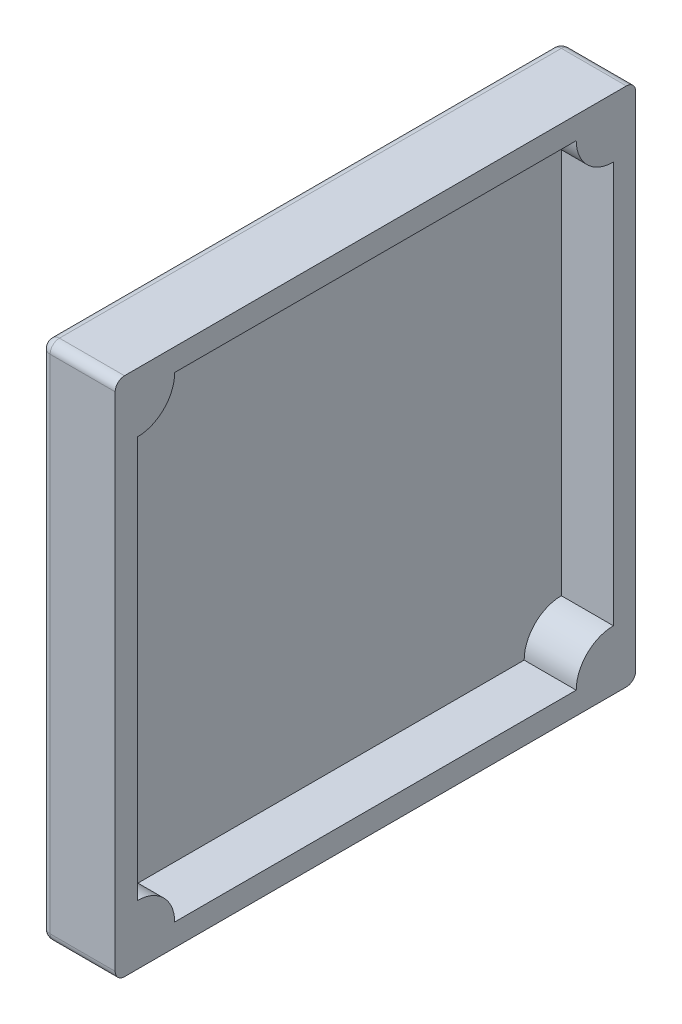
ISO-10303-21;
HEADER;
FILE_DESCRIPTION(('STEP AP214'),'2;1');
FILE_NAME('part.step','',(''),(''),'','','');
FILE_SCHEMA(('AUTOMOTIVE_DESIGN { 1 0 10303 214 1 1 1 1 }'));
ENDSEC;
DATA;
#1=APPLICATION_CONTEXT('core data for automotive mechanical design processes');
#2=APPLICATION_PROTOCOL_DEFINITION('international standard','automotive_design',2000,#1);
#3=PRODUCT_CONTEXT('',#1,'mechanical');
#4=PRODUCT('Part','Part','',(#3));
#5=PRODUCT_RELATED_PRODUCT_CATEGORY('part','',(#4));
#6=PRODUCT_DEFINITION_FORMATION('','',#4);
#7=PRODUCT_DEFINITION_CONTEXT('part definition',#1,'design');
#8=PRODUCT_DEFINITION('design','',#6,#7);
#9=PRODUCT_DEFINITION_SHAPE('','',#8);
#10=(LENGTH_UNIT() NAMED_UNIT(*) SI_UNIT(.MILLI.,.METRE.));
#11=(NAMED_UNIT(*) PLANE_ANGLE_UNIT() SI_UNIT($,.RADIAN.));
#12=(NAMED_UNIT(*) SI_UNIT($,.STERADIAN.) SOLID_ANGLE_UNIT());
#13=UNCERTAINTY_MEASURE_WITH_UNIT(LENGTH_MEASURE(1.E-05),#10,'distance_accuracy_value','');
#14=(GEOMETRIC_REPRESENTATION_CONTEXT(3) GLOBAL_UNCERTAINTY_ASSIGNED_CONTEXT((#13)) GLOBAL_UNIT_ASSIGNED_CONTEXT((#10,
#11,#12)) REPRESENTATION_CONTEXT('',''));
#15=CARTESIAN_POINT('',(0.,0.,0.));
#16=DIRECTION('',(0.,0.,1.));
#17=DIRECTION('',(1.,0.,0.));
#18=AXIS2_PLACEMENT_3D('',#15,#16,#17);
#19=CARTESIAN_POINT('',(25.4,0.,0.));
#20=DIRECTION('',(1.,0.,0.));
#21=DIRECTION('',(0.,0.,-1.));
#22=AXIS2_PLACEMENT_3D('',#19,#20,#21);
#23=PLANE('',#22);
#24=DIRECTION('',(0.,0.,1.));
#25=VECTOR('',#24,1.);
#26=CARTESIAN_POINT('',(25.4,81.28,88.9));
#27=LINE('',#26,#25);
#28=CARTESIAN_POINT('',(25.4,81.28,-68.58));
#29=VERTEX_POINT('',#28);
#30=CARTESIAN_POINT('',(25.4,81.28,68.58));
#31=VERTEX_POINT('',#30);
#32=EDGE_CURVE('E258',#29,#31,#27,.T.);
#33=ORIENTED_EDGE('',*,*,#32,.F.);
#34=CARTESIAN_POINT('',(25.4,81.28,-81.28));
#35=DIRECTION('',(1.,0.,0.));
#36=DIRECTION('',(0.,0.,-1.));
#37=AXIS2_PLACEMENT_3D('',#34,#35,#36);
#38=CIRCLE('',#37,12.7);
#39=CARTESIAN_POINT('',(25.4,68.58,-81.28));
#40=VERTEX_POINT('',#39);
#41=EDGE_CURVE('E175',#29,#40,#38,.T.);
#42=ORIENTED_EDGE('',*,*,#41,.T.);
#43=DIRECTION('',(0.,1.,0.));
#44=VECTOR('',#43,1.);
#45=CARTESIAN_POINT('',(25.4,-88.9,-81.28));
#46=LINE('',#45,#44);
#47=CARTESIAN_POINT('',(25.4,-68.5799999999999,-81.28));
#48=VERTEX_POINT('',#47);
#49=EDGE_CURVE('E255',#48,#40,#46,.T.);
#50=ORIENTED_EDGE('',*,*,#49,.F.);
#51=CARTESIAN_POINT('',(25.4,-81.2799999999999,-81.28));
#52=DIRECTION('',(1.,0.,0.));
#53=DIRECTION('',(0.,0.,-1.));
#54=AXIS2_PLACEMENT_3D('',#51,#52,#53);
#55=CIRCLE('',#54,12.7);
#56=CARTESIAN_POINT('',(25.4,-81.2799999999999,-68.58));
#57=VERTEX_POINT('',#56);
#58=EDGE_CURVE('E185',#48,#57,#55,.T.);
#59=ORIENTED_EDGE('',*,*,#58,.T.);
#60=DIRECTION('',(0.,0.,-1.));
#61=VECTOR('',#60,1.);
#62=CARTESIAN_POINT('',(25.4,-81.28,88.9));
#63=LINE('',#62,#61);
#64=CARTESIAN_POINT('',(25.4,-81.2799999999999,68.58));
#65=VERTEX_POINT('',#64);
#66=EDGE_CURVE('E174',#65,#57,#63,.T.);
#67=ORIENTED_EDGE('',*,*,#66,.F.);
#68=CARTESIAN_POINT('',(25.4,-81.2799999999999,81.28));
#69=DIRECTION('',(1.,0.,0.));
#70=DIRECTION('',(0.,0.,-1.));
#71=AXIS2_PLACEMENT_3D('',#68,#69,#70);
#72=CIRCLE('',#71,12.7);
#73=CARTESIAN_POINT('',(25.4,-68.5799999999999,81.28));
#74=VERTEX_POINT('',#73);
#75=EDGE_CURVE('E163',#65,#74,#72,.T.);
#76=ORIENTED_EDGE('',*,*,#75,.T.);
#77=DIRECTION('',(0.,-1.,0.));
#78=VECTOR('',#77,1.);
#79=CARTESIAN_POINT('',(25.4,-88.9,81.28));
#80=LINE('',#79,#78);
#81=CARTESIAN_POINT('',(25.4,68.58,81.28));
#82=VERTEX_POINT('',#81);
#83=EDGE_CURVE('E167',#82,#74,#80,.T.);
#84=ORIENTED_EDGE('',*,*,#83,.F.);
#85=CARTESIAN_POINT('',(25.4,81.28,81.28));
#86=DIRECTION('',(1.,0.,0.));
#87=DIRECTION('',(0.,0.,-1.));
#88=AXIS2_PLACEMENT_3D('',#85,#86,#87);
#89=CIRCLE('',#88,12.7);
#90=EDGE_CURVE('E182',#82,#31,#89,.T.);
#91=ORIENTED_EDGE('',*,*,#90,.T.);
#92=EDGE_LOOP('',(#33,#42,#50,#59,#67,#76,#84,#91));
#93=FACE_BOUND('',#92,.T.);
#94=CARTESIAN_POINT('',(25.4,-85.725,85.725));
#95=DIRECTION('',(1.,0.,0.));
#96=DIRECTION('',(0.,0.,-1.));
#97=AXIS2_PLACEMENT_3D('',#94,#95,#96);
#98=CIRCLE('',#97,3.175);
#99=CARTESIAN_POINT('',(25.4,-88.9,85.725));
#100=VERTEX_POINT('',#99);
#101=CARTESIAN_POINT('',(25.4,-85.725,88.9));
#102=VERTEX_POINT('',#101);
#103=EDGE_CURVE('E253',#100,#102,#98,.F.);
#104=ORIENTED_EDGE('',*,*,#103,.F.);
#105=DIRECTION('',(0.,0.,-1.));
#106=VECTOR('',#105,1.);
#107=CARTESIAN_POINT('',(25.4,-88.9,88.9));
#108=LINE('',#107,#106);
#109=CARTESIAN_POINT('',(25.4,-88.9,-85.725));
#110=VERTEX_POINT('',#109);
#111=EDGE_CURVE('E197',#100,#110,#108,.T.);
#112=ORIENTED_EDGE('',*,*,#111,.T.);
#113=CARTESIAN_POINT('',(25.4,-85.725,-85.725));
#114=DIRECTION('',(1.,0.,0.));
#115=DIRECTION('',(0.,0.,-1.));
#116=AXIS2_PLACEMENT_3D('',#113,#114,#115);
#117=CIRCLE('',#116,3.175);
#118=CARTESIAN_POINT('',(25.4,-85.725,-88.9));
#119=VERTEX_POINT('',#118);
#120=EDGE_CURVE('E249',#119,#110,#117,.F.);
#121=ORIENTED_EDGE('',*,*,#120,.F.);
#122=DIRECTION('',(0.,1.,0.));
#123=VECTOR('',#122,1.);
#124=CARTESIAN_POINT('',(25.4,-88.9,-88.9));
#125=LINE('',#124,#123);
#126=CARTESIAN_POINT('',(25.4,85.725,-88.9));
#127=VERTEX_POINT('',#126);
#128=EDGE_CURVE('E183',#119,#127,#125,.T.);
#129=ORIENTED_EDGE('',*,*,#128,.T.);
#130=CARTESIAN_POINT('',(25.4,85.725,-85.725));
#131=DIRECTION('',(1.,0.,0.));
#132=DIRECTION('',(0.,0.,-1.));
#133=AXIS2_PLACEMENT_3D('',#130,#131,#132);
#134=CIRCLE('',#133,3.175);
#135=CARTESIAN_POINT('',(25.4,88.9,-85.725));
#136=VERTEX_POINT('',#135);
#137=EDGE_CURVE('E204',#136,#127,#134,.F.);
#138=ORIENTED_EDGE('',*,*,#137,.F.);
#139=DIRECTION('',(0.,0.,1.));
#140=VECTOR('',#139,1.);
#141=CARTESIAN_POINT('',(25.4,88.9,88.9));
#142=LINE('',#141,#140);
#143=CARTESIAN_POINT('',(25.4,88.9,85.725));
#144=VERTEX_POINT('',#143);
#145=EDGE_CURVE('E188',#136,#144,#142,.T.);
#146=ORIENTED_EDGE('',*,*,#145,.T.);
#147=CARTESIAN_POINT('',(25.4,85.725,85.725));
#148=DIRECTION('',(1.,0.,0.));
#149=DIRECTION('',(0.,0.,-1.));
#150=AXIS2_PLACEMENT_3D('',#147,#148,#149);
#151=CIRCLE('',#150,3.175);
#152=CARTESIAN_POINT('',(25.4,85.725,88.9));
#153=VERTEX_POINT('',#152);
#154=EDGE_CURVE('E251',#153,#144,#151,.F.);
#155=ORIENTED_EDGE('',*,*,#154,.F.);
#156=DIRECTION('',(0.,-1.,0.));
#157=VECTOR('',#156,1.);
#158=CARTESIAN_POINT('',(25.4,-88.9,88.9));
#159=LINE('',#158,#157);
#160=EDGE_CURVE('E194',#153,#102,#159,.T.);
#161=ORIENTED_EDGE('',*,*,#160,.T.);
#162=EDGE_LOOP('',(#104,#112,#121,#129,#138,#146,#155,#161));
#163=FACE_BOUND('',#162,.T.);
#164=ADVANCED_FACE('F36',(#93,#163),#23,.T.);
#165=CARTESIAN_POINT('',(0.,0.,0.));
#166=DIRECTION('',(-1.,0.,0.));
#167=DIRECTION('',(0.,0.,1.));
#168=AXIS2_PLACEMENT_3D('',#165,#166,#167);
#169=PLANE('',#168);
#170=DIRECTION('',(0.,-1.,0.));
#171=VECTOR('',#170,1.);
#172=CARTESIAN_POINT('',(0.,88.9,85.725));
#173=LINE('',#172,#171);
#174=CARTESIAN_POINT('',(0.,-85.725,85.725));
#175=VERTEX_POINT('',#174);
#176=CARTESIAN_POINT('',(0.,85.725,85.725));
#177=VERTEX_POINT('',#176);
#178=EDGE_CURVE('E211',#175,#177,#173,.F.);
#179=ORIENTED_EDGE('',*,*,#178,.T.);
#180=DIRECTION('',(0.,0.,1.));
#181=VECTOR('',#180,1.);
#182=CARTESIAN_POINT('',(0.,85.725,-88.9));
#183=LINE('',#182,#181);
#184=CARTESIAN_POINT('',(0.,85.725,-85.725));
#185=VERTEX_POINT('',#184);
#186=EDGE_CURVE('E207',#177,#185,#183,.F.);
#187=ORIENTED_EDGE('',*,*,#186,.T.);
#188=DIRECTION('',(0.,1.,0.));
#189=VECTOR('',#188,1.);
#190=CARTESIAN_POINT('',(0.,-88.9,-85.725));
#191=LINE('',#190,#189);
#192=CARTESIAN_POINT('',(0.,-85.725,-85.725));
#193=VERTEX_POINT('',#192);
#194=EDGE_CURVE('E296',#185,#193,#191,.F.);
#195=ORIENTED_EDGE('',*,*,#194,.T.);
#196=DIRECTION('',(0.,0.,-1.));
#197=VECTOR('',#196,1.);
#198=CARTESIAN_POINT('',(0.,-85.725,88.9));
#199=LINE('',#198,#197);
#200=EDGE_CURVE('E294',#193,#175,#199,.F.);
#201=ORIENTED_EDGE('',*,*,#200,.T.);
#202=EDGE_LOOP('',(#179,#187,#195,#201));
#203=FACE_BOUND('',#202,.T.);
#204=ADVANCED_FACE('F367',(#203),#169,.T.);
#205=CARTESIAN_POINT('',(3.175,-88.9,-85.725));
#206=DIRECTION('',(0.,-1.,0.));
#207=DIRECTION('',(0.,0.,-1.));
#208=AXIS2_PLACEMENT_3D('',#205,#206,#207);
#209=CYLINDRICAL_SURFACE('',#208,3.175);
#210=CARTESIAN_POINT('',(3.175,-85.725,-85.725));
#211=DIRECTION('',(0.,-1.,0.));
#212=DIRECTION('',(0.,0.,-1.));
#213=AXIS2_PLACEMENT_3D('',#210,#211,#212);
#214=CIRCLE('',#213,3.175);
#215=CARTESIAN_POINT('',(3.175,-85.725,-88.9));
#216=VERTEX_POINT('',#215);
#217=EDGE_CURVE('E309',#216,#193,#214,.F.);
#218=ORIENTED_EDGE('',*,*,#217,.T.);
#219=ORIENTED_EDGE('',*,*,#194,.F.);
#220=CARTESIAN_POINT('',(3.175,85.725,-85.725));
#221=DIRECTION('',(0.,1.,0.));
#222=DIRECTION('',(0.,0.,1.));
#223=AXIS2_PLACEMENT_3D('',#220,#221,#222);
#224=CIRCLE('',#223,3.175);
#225=CARTESIAN_POINT('',(3.175,85.725,-88.9));
#226=VERTEX_POINT('',#225);
#227=EDGE_CURVE('E304',#226,#185,#224,.T.);
#228=ORIENTED_EDGE('',*,*,#227,.F.);
#229=DIRECTION('',(0.,1.,0.));
#230=VECTOR('',#229,1.);
#231=CARTESIAN_POINT('',(3.175,88.9,-88.9));
#232=LINE('',#231,#230);
#233=EDGE_CURVE('E218',#216,#226,#232,.T.);
#234=ORIENTED_EDGE('',*,*,#233,.F.);
#235=EDGE_LOOP('',(#218,#219,#228,#234));
#236=FACE_BOUND('',#235,.T.);
#237=ADVANCED_FACE('F386',(#236),#209,.T.);
#238=CARTESIAN_POINT('',(3.175,85.725,88.9));
#239=DIRECTION('',(0.,0.,-1.));
#240=DIRECTION('',(-1.,0.,0.));
#241=AXIS2_PLACEMENT_3D('',#238,#239,#240);
#242=CYLINDRICAL_SURFACE('',#241,3.175);
#243=CARTESIAN_POINT('',(3.175,85.725,85.725));
#244=DIRECTION('',(0.,0.,1.));
#245=DIRECTION('',(1.,0.,0.));
#246=AXIS2_PLACEMENT_3D('',#243,#244,#245);
#247=CIRCLE('',#246,3.175);
#248=CARTESIAN_POINT('',(3.175,88.9,85.725));
#249=VERTEX_POINT('',#248);
#250=EDGE_CURVE('E312',#177,#249,#247,.F.);
#251=ORIENTED_EDGE('',*,*,#250,.T.);
#252=DIRECTION('',(0.,0.,1.));
#253=VECTOR('',#252,1.);
#254=CARTESIAN_POINT('',(3.175,88.9,88.9));
#255=LINE('',#254,#253);
#256=CARTESIAN_POINT('',(3.175,88.9,-85.725));
#257=VERTEX_POINT('',#256);
#258=EDGE_CURVE('E226',#257,#249,#255,.T.);
#259=ORIENTED_EDGE('',*,*,#258,.F.);
#260=CARTESIAN_POINT('',(3.175,85.725,-85.725));
#261=DIRECTION('',(0.,0.,-1.));
#262=DIRECTION('',(0.,1.,0.));
#263=AXIS2_PLACEMENT_3D('',#260,#261,#262);
#264=CIRCLE('',#263,3.175);
#265=EDGE_CURVE('E306',#185,#257,#264,.T.);
#266=ORIENTED_EDGE('',*,*,#265,.F.);
#267=ORIENTED_EDGE('',*,*,#186,.F.);
#268=EDGE_LOOP('',(#251,#259,#266,#267));
#269=FACE_BOUND('',#268,.T.);
#270=ADVANCED_FACE('F364',(#269),#242,.T.);
#271=CARTESIAN_POINT('',(3.175,-88.9,85.725));
#272=DIRECTION('',(0.,1.,0.));
#273=DIRECTION('',(0.,0.,1.));
#274=AXIS2_PLACEMENT_3D('',#271,#272,#273);
#275=CYLINDRICAL_SURFACE('',#274,3.175);
#276=CARTESIAN_POINT('',(3.175,-85.725,85.725));
#277=DIRECTION('',(0.,-1.,0.));
#278=DIRECTION('',(0.,0.,-1.));
#279=AXIS2_PLACEMENT_3D('',#276,#277,#278);
#280=CIRCLE('',#279,3.175);
#281=CARTESIAN_POINT('',(3.175,-85.725,88.9));
#282=VERTEX_POINT('',#281);
#283=EDGE_CURVE('E288',#175,#282,#280,.F.);
#284=ORIENTED_EDGE('',*,*,#283,.T.);
#285=DIRECTION('',(0.,-1.,0.));
#286=VECTOR('',#285,1.);
#287=CARTESIAN_POINT('',(3.175,-88.9,88.9));
#288=LINE('',#287,#286);
#289=CARTESIAN_POINT('',(3.175,85.725,88.9));
#290=VERTEX_POINT('',#289);
#291=EDGE_CURVE('E210',#290,#282,#288,.T.);
#292=ORIENTED_EDGE('',*,*,#291,.F.);
#293=CARTESIAN_POINT('',(3.175,85.725,85.725));
#294=DIRECTION('',(0.,1.,0.));
#295=DIRECTION('',(0.,0.,1.));
#296=AXIS2_PLACEMENT_3D('',#293,#294,#295);
#297=CIRCLE('',#296,3.175);
#298=EDGE_CURVE('E320',#177,#290,#297,.T.);
#299=ORIENTED_EDGE('',*,*,#298,.F.);
#300=ORIENTED_EDGE('',*,*,#178,.F.);
#301=EDGE_LOOP('',(#284,#292,#299,#300));
#302=FACE_BOUND('',#301,.T.);
#303=ADVANCED_FACE('F334',(#302),#275,.T.);
#304=CARTESIAN_POINT('',(3.175,-85.725,88.9));
#305=DIRECTION('',(0.,0.,1.));
#306=DIRECTION('',(1.,0.,0.));
#307=AXIS2_PLACEMENT_3D('',#304,#305,#306);
#308=CYLINDRICAL_SURFACE('',#307,3.175);
#309=CARTESIAN_POINT('',(3.175,-85.725,85.725));
#310=DIRECTION('',(0.,0.,1.));
#311=DIRECTION('',(1.,0.,0.));
#312=AXIS2_PLACEMENT_3D('',#309,#310,#311);
#313=CIRCLE('',#312,3.175);
#314=CARTESIAN_POINT('',(3.175,-88.9,85.725));
#315=VERTEX_POINT('',#314);
#316=EDGE_CURVE('E326',#315,#175,#313,.F.);
#317=ORIENTED_EDGE('',*,*,#316,.T.);
#318=ORIENTED_EDGE('',*,*,#200,.F.);
#319=CARTESIAN_POINT('',(3.175,-85.725,-85.725));
#320=DIRECTION('',(0.,0.,-1.));
#321=DIRECTION('',(-1.,0.,0.));
#322=AXIS2_PLACEMENT_3D('',#319,#320,#321);
#323=CIRCLE('',#322,3.175);
#324=CARTESIAN_POINT('',(3.175,-88.9,-85.725));
#325=VERTEX_POINT('',#324);
#326=EDGE_CURVE('E317',#325,#193,#323,.T.);
#327=ORIENTED_EDGE('',*,*,#326,.F.);
#328=DIRECTION('',(0.,0.,-1.));
#329=VECTOR('',#328,1.);
#330=CARTESIAN_POINT('',(3.175,-88.9,-88.9));
#331=LINE('',#330,#329);
#332=EDGE_CURVE('E203',#315,#325,#331,.T.);
#333=ORIENTED_EDGE('',*,*,#332,.F.);
#334=EDGE_LOOP('',(#317,#318,#327,#333));
#335=FACE_BOUND('',#334,.T.);
#336=ADVANCED_FACE('F371',(#335),#308,.T.);
#337=CARTESIAN_POINT('',(3.175,-85.725,85.725));
#338=DIRECTION('',(0.,0.,1.));
#339=DIRECTION('',(1.,0.,0.));
#340=AXIS2_PLACEMENT_3D('',#337,#338,#339);
#341=SPHERICAL_SURFACE('',#340,3.175);
#342=ORIENTED_EDGE('',*,*,#316,.F.);
#343=CARTESIAN_POINT('',(3.175,-85.725,85.725));
#344=DIRECTION('',(-1.,0.,0.));
#345=DIRECTION('',(0.,0.,1.));
#346=AXIS2_PLACEMENT_3D('',#343,#344,#345);
#347=CIRCLE('',#346,3.175);
#348=EDGE_CURVE('E285',#315,#282,#347,.T.);
#349=ORIENTED_EDGE('',*,*,#348,.T.);
#350=ORIENTED_EDGE('',*,*,#283,.F.);
#351=EDGE_LOOP('',(#342,#349,#350));
#352=FACE_BOUND('',#351,.T.);
#353=ADVANCED_FACE('F338',(#352),#341,.T.);
#354=CARTESIAN_POINT('',(3.175,85.725,85.725));
#355=DIRECTION('',(0.,0.,1.));
#356=DIRECTION('',(0.,-1.,0.));
#357=AXIS2_PLACEMENT_3D('',#354,#355,#356);
#358=SPHERICAL_SURFACE('',#357,3.175);
#359=ORIENTED_EDGE('',*,*,#298,.T.);
#360=CARTESIAN_POINT('',(3.175,85.725,85.725));
#361=DIRECTION('',(-1.,0.,0.));
#362=DIRECTION('',(0.,0.,1.));
#363=AXIS2_PLACEMENT_3D('',#360,#361,#362);
#364=CIRCLE('',#363,3.175);
#365=EDGE_CURVE('E323',#290,#249,#364,.T.);
#366=ORIENTED_EDGE('',*,*,#365,.T.);
#367=ORIENTED_EDGE('',*,*,#250,.F.);
#368=EDGE_LOOP('',(#359,#366,#367));
#369=FACE_BOUND('',#368,.T.);
#370=ADVANCED_FACE('F353',(#369),#358,.T.);
#371=CARTESIAN_POINT('',(3.175,-85.725,-85.725));
#372=DIRECTION('',(0.,-1.,0.));
#373=DIRECTION('',(1.,0.,0.));
#374=AXIS2_PLACEMENT_3D('',#371,#372,#373);
#375=SPHERICAL_SURFACE('',#374,3.175);
#376=CARTESIAN_POINT('',(3.175,-85.725,-85.725));
#377=DIRECTION('',(-1.,0.,0.));
#378=DIRECTION('',(0.,0.,1.));
#379=AXIS2_PLACEMENT_3D('',#376,#377,#378);
#380=CIRCLE('',#379,3.175);
#381=EDGE_CURVE('E315',#216,#325,#380,.T.);
#382=ORIENTED_EDGE('',*,*,#381,.T.);
#383=ORIENTED_EDGE('',*,*,#326,.T.);
#384=ORIENTED_EDGE('',*,*,#217,.F.);
#385=EDGE_LOOP('',(#382,#383,#384));
#386=FACE_BOUND('',#385,.T.);
#387=ADVANCED_FACE('F389',(#386),#375,.T.);
#388=CARTESIAN_POINT('',(76.2,-88.9,88.9));
#389=DIRECTION('',(0.,1.,0.));
#390=DIRECTION('',(0.,0.,1.));
#391=AXIS2_PLACEMENT_3D('',#388,#389,#390);
#392=PLANE('',#391);
#393=ORIENTED_EDGE('',*,*,#111,.F.);
#394=DIRECTION('',(-1.,0.,0.));
#395=VECTOR('',#394,1.);
#396=CARTESIAN_POINT('',(76.2,-88.9,85.725));
#397=LINE('',#396,#395);
#398=EDGE_CURVE('E205',#100,#315,#397,.T.);
#399=ORIENTED_EDGE('',*,*,#398,.T.);
#400=ORIENTED_EDGE('',*,*,#332,.T.);
#401=DIRECTION('',(-1.,0.,0.));
#402=VECTOR('',#401,1.);
#403=CARTESIAN_POINT('',(76.2,-88.9,-85.725));
#404=LINE('',#403,#402);
#405=EDGE_CURVE('E200',#325,#110,#404,.F.);
#406=ORIENTED_EDGE('',*,*,#405,.T.);
#407=EDGE_LOOP('',(#393,#399,#400,#406));
#408=FACE_BOUND('',#407,.T.);
#409=ADVANCED_FACE('F375',(#408),#392,.F.);
#410=CARTESIAN_POINT('',(3.175,85.725,-85.725));
#411=DIRECTION('',(-1.,0.,0.));
#412=DIRECTION('',(0.,0.,1.));
#413=AXIS2_PLACEMENT_3D('',#410,#411,#412);
#414=SPHERICAL_SURFACE('',#413,3.175);
#415=ORIENTED_EDGE('',*,*,#227,.T.);
#416=ORIENTED_EDGE('',*,*,#265,.T.);
#417=CARTESIAN_POINT('',(3.175,85.725,-85.725));
#418=DIRECTION('',(-1.,0.,0.));
#419=DIRECTION('',(0.,0.,1.));
#420=AXIS2_PLACEMENT_3D('',#417,#418,#419);
#421=CIRCLE('',#420,3.175);
#422=EDGE_CURVE('E277',#226,#257,#421,.F.);
#423=ORIENTED_EDGE('',*,*,#422,.F.);
#424=EDGE_LOOP('',(#415,#416,#423));
#425=FACE_BOUND('',#424,.T.);
#426=ADVANCED_FACE('F382',(#425),#414,.T.);
#427=CARTESIAN_POINT('',(76.2,-88.9,-88.9));
#428=DIRECTION('',(0.,0.,1.));
#429=DIRECTION('',(1.,0.,0.));
#430=AXIS2_PLACEMENT_3D('',#427,#428,#429);
#431=PLANE('',#430);
#432=ORIENTED_EDGE('',*,*,#128,.F.);
#433=DIRECTION('',(-1.,0.,0.));
#434=VECTOR('',#433,1.);
#435=CARTESIAN_POINT('',(76.2,-85.725,-88.9));
#436=LINE('',#435,#434);
#437=EDGE_CURVE('E219',#119,#216,#436,.T.);
#438=ORIENTED_EDGE('',*,*,#437,.T.);
#439=ORIENTED_EDGE('',*,*,#233,.T.);
#440=DIRECTION('',(-1.,0.,0.));
#441=VECTOR('',#440,1.);
#442=CARTESIAN_POINT('',(76.2,85.725,-88.9));
#443=LINE('',#442,#441);
#444=EDGE_CURVE('E215',#226,#127,#443,.F.);
#445=ORIENTED_EDGE('',*,*,#444,.T.);
#446=EDGE_LOOP('',(#432,#438,#439,#445));
#447=FACE_BOUND('',#446,.T.);
#448=ADVANCED_FACE('F395',(#447),#431,.F.);
#449=CARTESIAN_POINT('',(76.2,88.9,88.9));
#450=DIRECTION('',(0.,-1.,0.));
#451=DIRECTION('',(0.,0.,-1.));
#452=AXIS2_PLACEMENT_3D('',#449,#450,#451);
#453=PLANE('',#452);
#454=ORIENTED_EDGE('',*,*,#145,.F.);
#455=DIRECTION('',(-1.,0.,0.));
#456=VECTOR('',#455,1.);
#457=CARTESIAN_POINT('',(76.2,88.9,-85.725));
#458=LINE('',#457,#456);
#459=EDGE_CURVE('E221',#136,#257,#458,.T.);
#460=ORIENTED_EDGE('',*,*,#459,.T.);
#461=ORIENTED_EDGE('',*,*,#258,.T.);
#462=DIRECTION('',(-1.,0.,0.));
#463=VECTOR('',#462,1.);
#464=CARTESIAN_POINT('',(76.2,88.9,85.725));
#465=LINE('',#464,#463);
#466=EDGE_CURVE('E223',#249,#144,#465,.F.);
#467=ORIENTED_EDGE('',*,*,#466,.T.);
#468=EDGE_LOOP('',(#454,#460,#461,#467));
#469=FACE_BOUND('',#468,.T.);
#470=ADVANCED_FACE('F359',(#469),#453,.F.);
#471=CARTESIAN_POINT('',(76.2,85.725,-85.725));
#472=DIRECTION('',(-1.,0.,0.));
#473=DIRECTION('',(0.,0.,1.));
#474=AXIS2_PLACEMENT_3D('',#471,#472,#473);
#475=CYLINDRICAL_SURFACE('',#474,3.175);
#476=ORIENTED_EDGE('',*,*,#459,.F.);
#477=ORIENTED_EDGE('',*,*,#137,.T.);
#478=ORIENTED_EDGE('',*,*,#444,.F.);
#479=ORIENTED_EDGE('',*,*,#422,.T.);
#480=EDGE_LOOP('',(#476,#477,#478,#479));
#481=FACE_BOUND('',#480,.T.);
#482=ADVANCED_FACE('F379',(#481),#475,.T.);
#483=CARTESIAN_POINT('',(76.2,-85.725,-85.725));
#484=DIRECTION('',(-1.,0.,0.));
#485=DIRECTION('',(0.,0.,1.));
#486=AXIS2_PLACEMENT_3D('',#483,#484,#485);
#487=CYLINDRICAL_SURFACE('',#486,3.175);
#488=ORIENTED_EDGE('',*,*,#437,.F.);
#489=ORIENTED_EDGE('',*,*,#120,.T.);
#490=ORIENTED_EDGE('',*,*,#405,.F.);
#491=ORIENTED_EDGE('',*,*,#381,.F.);
#492=EDGE_LOOP('',(#488,#489,#490,#491));
#493=FACE_BOUND('',#492,.T.);
#494=ADVANCED_FACE('F393',(#493),#487,.T.);
#495=CARTESIAN_POINT('',(76.2,-88.9,88.9));
#496=DIRECTION('',(0.,0.,-1.));
#497=DIRECTION('',(-1.,0.,0.));
#498=AXIS2_PLACEMENT_3D('',#495,#496,#497);
#499=PLANE('',#498);
#500=ORIENTED_EDGE('',*,*,#160,.F.);
#501=DIRECTION('',(-1.,0.,0.));
#502=VECTOR('',#501,1.);
#503=CARTESIAN_POINT('',(76.2,85.725,88.9));
#504=LINE('',#503,#502);
#505=EDGE_CURVE('E208',#153,#290,#504,.T.);
#506=ORIENTED_EDGE('',*,*,#505,.T.);
#507=ORIENTED_EDGE('',*,*,#291,.T.);
#508=DIRECTION('',(-1.,0.,0.));
#509=VECTOR('',#508,1.);
#510=CARTESIAN_POINT('',(76.2,-85.725,88.9));
#511=LINE('',#510,#509);
#512=EDGE_CURVE('E212',#282,#102,#511,.F.);
#513=ORIENTED_EDGE('',*,*,#512,.T.);
#514=EDGE_LOOP('',(#500,#506,#507,#513));
#515=FACE_BOUND('',#514,.T.);
#516=ADVANCED_FACE('F347',(#515),#499,.F.);
#517=CARTESIAN_POINT('',(76.2,85.725,85.725));
#518=DIRECTION('',(-1.,0.,0.));
#519=DIRECTION('',(0.,0.,1.));
#520=AXIS2_PLACEMENT_3D('',#517,#518,#519);
#521=CYLINDRICAL_SURFACE('',#520,3.175);
#522=ORIENTED_EDGE('',*,*,#505,.F.);
#523=ORIENTED_EDGE('',*,*,#154,.T.);
#524=ORIENTED_EDGE('',*,*,#466,.F.);
#525=ORIENTED_EDGE('',*,*,#365,.F.);
#526=EDGE_LOOP('',(#522,#523,#524,#525));
#527=FACE_BOUND('',#526,.T.);
#528=ADVANCED_FACE('F356',(#527),#521,.T.);
#529=CARTESIAN_POINT('',(76.2,-85.725,85.725));
#530=DIRECTION('',(-1.,0.,0.));
#531=DIRECTION('',(0.,0.,1.));
#532=AXIS2_PLACEMENT_3D('',#529,#530,#531);
#533=CYLINDRICAL_SURFACE('',#532,3.175);
#534=ORIENTED_EDGE('',*,*,#398,.F.);
#535=ORIENTED_EDGE('',*,*,#103,.T.);
#536=ORIENTED_EDGE('',*,*,#512,.F.);
#537=ORIENTED_EDGE('',*,*,#348,.F.);
#538=EDGE_LOOP('',(#534,#535,#536,#537));
#539=FACE_BOUND('',#538,.T.);
#540=ADVANCED_FACE('F344',(#539),#533,.T.);
#541=CARTESIAN_POINT('',(76.2,-88.9,81.28));
#542=DIRECTION('',(0.,0.,-1.));
#543=DIRECTION('',(-1.,0.,0.));
#544=AXIS2_PLACEMENT_3D('',#541,#542,#543);
#545=PLANE('',#544);
#546=DIRECTION('',(1.,0.,0.));
#547=VECTOR('',#546,1.);
#548=CARTESIAN_POINT('',(-0.002000000000002,68.58,81.28));
#549=LINE('',#548,#547);
#550=CARTESIAN_POINT('',(7.62,68.58,81.28));
#551=VERTEX_POINT('',#550);
#552=EDGE_CURVE('E170',#551,#82,#549,.T.);
#553=ORIENTED_EDGE('',*,*,#552,.T.);
#554=ORIENTED_EDGE('',*,*,#83,.T.);
#555=DIRECTION('',(1.,0.,0.));
#556=VECTOR('',#555,1.);
#557=CARTESIAN_POINT('',(-0.002000000000002,-68.5799999999999,81.28));
#558=LINE('',#557,#556);
#559=CARTESIAN_POINT('',(7.62,-68.5799999999999,81.28));
#560=VERTEX_POINT('',#559);
#561=EDGE_CURVE('E44',#560,#74,#558,.T.);
#562=ORIENTED_EDGE('',*,*,#561,.F.);
#563=DIRECTION('',(0.,-1.,0.));
#564=VECTOR('',#563,1.);
#565=CARTESIAN_POINT('',(7.62,0.,81.28));
#566=LINE('',#565,#564);
#567=EDGE_CURVE('E51',#551,#560,#566,.T.);
#568=ORIENTED_EDGE('',*,*,#567,.F.);
#569=EDGE_LOOP('',(#553,#554,#562,#568));
#570=FACE_BOUND('',#569,.T.);
#571=ADVANCED_FACE('F168',(#570),#545,.T.);
#572=CARTESIAN_POINT('',(76.2,-81.28,88.9));
#573=DIRECTION('',(0.,1.,0.));
#574=DIRECTION('',(0.,0.,1.));
#575=AXIS2_PLACEMENT_3D('',#572,#573,#574);
#576=PLANE('',#575);
#577=DIRECTION('',(1.,0.,0.));
#578=VECTOR('',#577,1.);
#579=CARTESIAN_POINT('',(-0.002000000000002,-81.2799999999999,68.58));
#580=LINE('',#579,#578);
#581=CARTESIAN_POINT('',(7.62,-81.28,68.58));
#582=VERTEX_POINT('',#581);
#583=EDGE_CURVE('E11',#582,#65,#580,.T.);
#584=ORIENTED_EDGE('',*,*,#583,.T.);
#585=ORIENTED_EDGE('',*,*,#66,.T.);
#586=DIRECTION('',(1.,0.,0.));
#587=VECTOR('',#586,1.);
#588=CARTESIAN_POINT('',(-0.002000000000002,-81.2799999999999,-68.58));
#589=LINE('',#588,#587);
#590=CARTESIAN_POINT('',(7.62,-81.2799999999999,-68.58));
#591=VERTEX_POINT('',#590);
#592=EDGE_CURVE('E235',#591,#57,#589,.T.);
#593=ORIENTED_EDGE('',*,*,#592,.F.);
#594=DIRECTION('',(0.,0.,-1.));
#595=VECTOR('',#594,1.);
#596=CARTESIAN_POINT('',(7.62,-81.28,0.));
#597=LINE('',#596,#595);
#598=EDGE_CURVE('E271',#582,#591,#597,.T.);
#599=ORIENTED_EDGE('',*,*,#598,.F.);
#600=EDGE_LOOP('',(#584,#585,#593,#599));
#601=FACE_BOUND('',#600,.T.);
#602=ADVANCED_FACE('F270',(#601),#576,.T.);
#603=CARTESIAN_POINT('',(76.2,81.28,88.9));
#604=DIRECTION('',(0.,-1.,0.));
#605=DIRECTION('',(0.,0.,-1.));
#606=AXIS2_PLACEMENT_3D('',#603,#604,#605);
#607=PLANE('',#606);
#608=DIRECTION('',(1.,0.,0.));
#609=VECTOR('',#608,1.);
#610=CARTESIAN_POINT('',(-0.002000000000002,81.28,-68.58));
#611=LINE('',#610,#609);
#612=CARTESIAN_POINT('',(7.62,81.28,-68.58));
#613=VERTEX_POINT('',#612);
#614=EDGE_CURVE('E227',#613,#29,#611,.T.);
#615=ORIENTED_EDGE('',*,*,#614,.T.);
#616=ORIENTED_EDGE('',*,*,#32,.T.);
#617=DIRECTION('',(1.,0.,0.));
#618=VECTOR('',#617,1.);
#619=CARTESIAN_POINT('',(-0.002000000000002,81.28,68.58));
#620=LINE('',#619,#618);
#621=CARTESIAN_POINT('',(7.62,81.28,68.58));
#622=VERTEX_POINT('',#621);
#623=EDGE_CURVE('E239',#622,#31,#620,.T.);
#624=ORIENTED_EDGE('',*,*,#623,.F.);
#625=DIRECTION('',(0.,0.,1.));
#626=VECTOR('',#625,1.);
#627=CARTESIAN_POINT('',(7.62,81.28,0.));
#628=LINE('',#627,#626);
#629=EDGE_CURVE('E57',#613,#622,#628,.T.);
#630=ORIENTED_EDGE('',*,*,#629,.F.);
#631=EDGE_LOOP('',(#615,#616,#624,#630));
#632=FACE_BOUND('',#631,.T.);
#633=ADVANCED_FACE('F529',(#632),#607,.T.);
#634=CARTESIAN_POINT('',(76.2,-88.9,-81.28));
#635=DIRECTION('',(0.,0.,1.));
#636=DIRECTION('',(1.,0.,0.));
#637=AXIS2_PLACEMENT_3D('',#634,#635,#636);
#638=PLANE('',#637);
#639=DIRECTION('',(1.,0.,0.));
#640=VECTOR('',#639,1.);
#641=CARTESIAN_POINT('',(-0.002000000000002,-68.5799999999999,-81.28));
#642=LINE('',#641,#640);
#643=CARTESIAN_POINT('',(7.62,-68.5799999999999,-81.28));
#644=VERTEX_POINT('',#643);
#645=EDGE_CURVE('E233',#644,#48,#642,.T.);
#646=ORIENTED_EDGE('',*,*,#645,.T.);
#647=ORIENTED_EDGE('',*,*,#49,.T.);
#648=DIRECTION('',(1.,0.,0.));
#649=VECTOR('',#648,1.);
#650=CARTESIAN_POINT('',(-0.002000000000002,68.58,-81.28));
#651=LINE('',#650,#649);
#652=CARTESIAN_POINT('',(7.62,68.58,-81.28));
#653=VERTEX_POINT('',#652);
#654=EDGE_CURVE('E229',#653,#40,#651,.T.);
#655=ORIENTED_EDGE('',*,*,#654,.F.);
#656=DIRECTION('',(0.,1.,0.));
#657=VECTOR('',#656,1.);
#658=CARTESIAN_POINT('',(7.62,0.,-81.28));
#659=LINE('',#658,#657);
#660=EDGE_CURVE('E280',#644,#653,#659,.T.);
#661=ORIENTED_EDGE('',*,*,#660,.F.);
#662=EDGE_LOOP('',(#646,#647,#655,#661));
#663=FACE_BOUND('',#662,.T.);
#664=ADVANCED_FACE('F283',(#663),#638,.T.);
#665=CARTESIAN_POINT('',(-0.002000000000002,81.28,-81.28));
#666=DIRECTION('',(1.,0.,0.));
#667=DIRECTION('',(0.,0.,-1.));
#668=AXIS2_PLACEMENT_3D('',#665,#666,#667);
#669=CYLINDRICAL_SURFACE('',#668,12.7);
#670=ORIENTED_EDGE('',*,*,#41,.F.);
#671=ORIENTED_EDGE('',*,*,#614,.F.);
#672=CARTESIAN_POINT('',(7.62,81.28,-81.28));
#673=DIRECTION('',(-1.,0.,0.));
#674=DIRECTION('',(0.,0.,1.));
#675=AXIS2_PLACEMENT_3D('',#672,#673,#674);
#676=CIRCLE('',#675,12.7);
#677=EDGE_CURVE('E230',#653,#613,#676,.T.);
#678=ORIENTED_EDGE('',*,*,#677,.F.);
#679=ORIENTED_EDGE('',*,*,#654,.T.);
#680=EDGE_LOOP('',(#670,#671,#678,#679));
#681=FACE_BOUND('',#680,.T.);
#682=ADVANCED_FACE('F38',(#681),#669,.T.);
#683=CARTESIAN_POINT('',(-0.002000000000002,-81.2799999999999,-81.28));
#684=DIRECTION('',(1.,0.,0.));
#685=DIRECTION('',(0.,0.,-1.));
#686=AXIS2_PLACEMENT_3D('',#683,#684,#685);
#687=CYLINDRICAL_SURFACE('',#686,12.7);
#688=ORIENTED_EDGE('',*,*,#58,.F.);
#689=ORIENTED_EDGE('',*,*,#645,.F.);
#690=CARTESIAN_POINT('',(7.62,-81.2799999999999,-81.28));
#691=DIRECTION('',(-1.,0.,0.));
#692=DIRECTION('',(0.,0.,1.));
#693=AXIS2_PLACEMENT_3D('',#690,#691,#692);
#694=CIRCLE('',#693,12.7);
#695=EDGE_CURVE('E232',#591,#644,#694,.T.);
#696=ORIENTED_EDGE('',*,*,#695,.F.);
#697=ORIENTED_EDGE('',*,*,#592,.T.);
#698=EDGE_LOOP('',(#688,#689,#696,#697));
#699=FACE_BOUND('',#698,.T.);
#700=ADVANCED_FACE('F266',(#699),#687,.T.);
#701=CARTESIAN_POINT('',(-0.002000000000002,81.28,81.28));
#702=DIRECTION('',(1.,0.,0.));
#703=DIRECTION('',(0.,0.,-1.));
#704=AXIS2_PLACEMENT_3D('',#701,#702,#703);
#705=CYLINDRICAL_SURFACE('',#704,12.7);
#706=ORIENTED_EDGE('',*,*,#90,.F.);
#707=ORIENTED_EDGE('',*,*,#552,.F.);
#708=CARTESIAN_POINT('',(7.62,81.28,81.28));
#709=DIRECTION('',(-1.,0.,0.));
#710=DIRECTION('',(0.,0.,1.));
#711=AXIS2_PLACEMENT_3D('',#708,#709,#710);
#712=CIRCLE('',#711,12.7);
#713=EDGE_CURVE('E237',#622,#551,#712,.T.);
#714=ORIENTED_EDGE('',*,*,#713,.F.);
#715=ORIENTED_EDGE('',*,*,#623,.T.);
#716=EDGE_LOOP('',(#706,#707,#714,#715));
#717=FACE_BOUND('',#716,.T.);
#718=ADVANCED_FACE('F563',(#717),#705,.T.);
#719=CARTESIAN_POINT('',(-0.002000000000002,-81.2799999999999,81.28));
#720=DIRECTION('',(1.,0.,0.));
#721=DIRECTION('',(0.,0.,-1.));
#722=AXIS2_PLACEMENT_3D('',#719,#720,#721);
#723=CYLINDRICAL_SURFACE('',#722,12.7);
#724=ORIENTED_EDGE('',*,*,#75,.F.);
#725=ORIENTED_EDGE('',*,*,#583,.F.);
#726=CARTESIAN_POINT('',(7.62,-81.2799999999999,81.28));
#727=DIRECTION('',(-1.,0.,0.));
#728=DIRECTION('',(0.,0.,1.));
#729=AXIS2_PLACEMENT_3D('',#726,#727,#728);
#730=CIRCLE('',#729,12.7);
#731=EDGE_CURVE('E164',#560,#582,#730,.T.);
#732=ORIENTED_EDGE('',*,*,#731,.F.);
#733=ORIENTED_EDGE('',*,*,#561,.T.);
#734=EDGE_LOOP('',(#724,#725,#732,#733));
#735=FACE_BOUND('',#734,.T.);
#736=ADVANCED_FACE('F160',(#735),#723,.T.);
#737=CARTESIAN_POINT('',(7.62,0.,0.));
#738=DIRECTION('',(-1.,0.,0.));
#739=DIRECTION('',(0.,0.,1.));
#740=AXIS2_PLACEMENT_3D('',#737,#738,#739);
#741=PLANE('',#740);
#742=ORIENTED_EDGE('',*,*,#731,.T.);
#743=ORIENTED_EDGE('',*,*,#598,.T.);
#744=ORIENTED_EDGE('',*,*,#695,.T.);
#745=ORIENTED_EDGE('',*,*,#660,.T.);
#746=ORIENTED_EDGE('',*,*,#677,.T.);
#747=ORIENTED_EDGE('',*,*,#629,.T.);
#748=ORIENTED_EDGE('',*,*,#713,.T.);
#749=ORIENTED_EDGE('',*,*,#567,.T.);
#750=EDGE_LOOP('',(#742,#743,#744,#745,#746,#747,#748,#749));
#751=FACE_BOUND('',#750,.T.);
#752=ADVANCED_FACE('F279',(#751),#741,.F.);
#753=CLOSED_SHELL('',(#164,#204,#237,#270,#303,#336,#353,#370,#387,#409,#426,#448,#470,#482,
#494,#516,#528,#540,#571,#602,#633,#664,#682,#700,#718,#736,#752));
#754=MANIFOLD_SOLID_BREP('B2',#753);
#755=ADVANCED_BREP_SHAPE_REPRESENTATION('',(#18,#754),#14);
#756=SHAPE_DEFINITION_REPRESENTATION(#9,#755);
ENDSEC;
END-ISO-10303-21;
